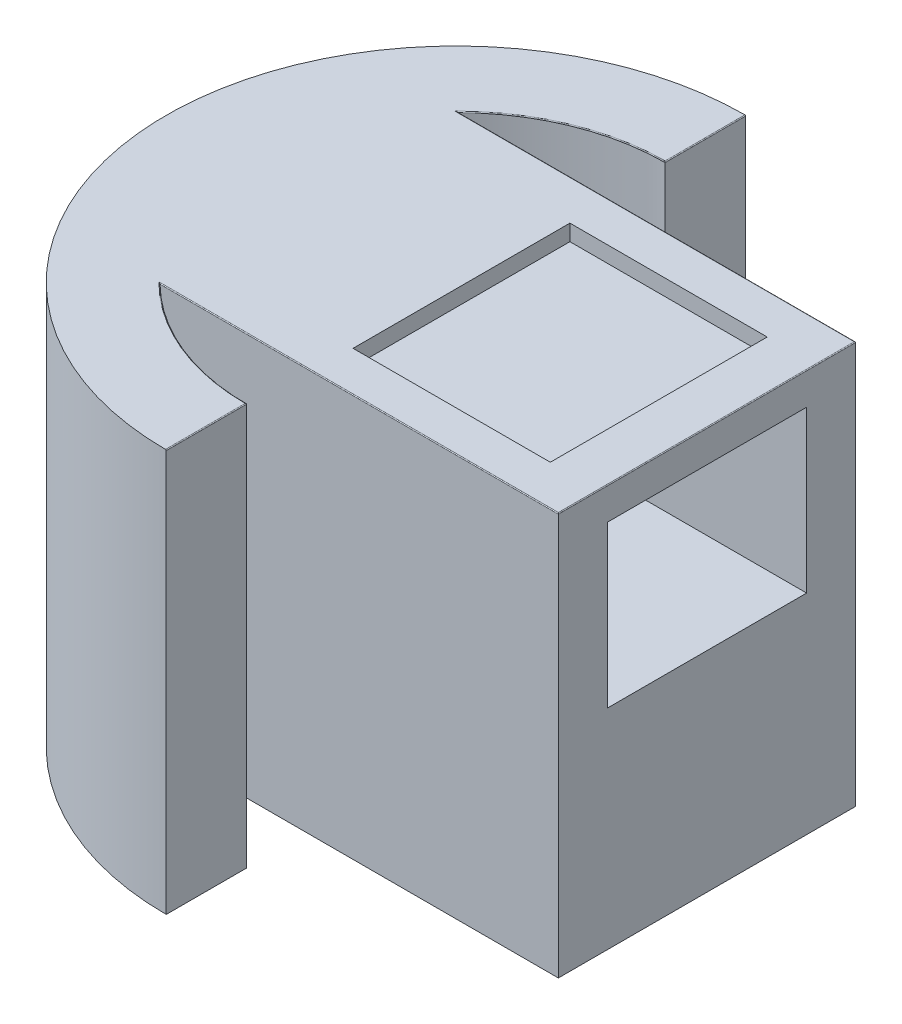
ISO-10303-21;
HEADER;
FILE_DESCRIPTION(('STEP AP214'),'2;1');
FILE_NAME('part.step','',(''),(''),'','','');
FILE_SCHEMA(('AUTOMOTIVE_DESIGN { 1 0 10303 214 1 1 1 1 }'));
ENDSEC;
DATA;
#1=APPLICATION_CONTEXT('core data for automotive mechanical design processes');
#2=APPLICATION_PROTOCOL_DEFINITION('international standard','automotive_design',2000,#1);
#3=PRODUCT_CONTEXT('',#1,'mechanical');
#4=PRODUCT('Part','Part','',(#3));
#5=PRODUCT_RELATED_PRODUCT_CATEGORY('part','',(#4));
#6=PRODUCT_DEFINITION_FORMATION('','',#4);
#7=PRODUCT_DEFINITION_CONTEXT('part definition',#1,'design');
#8=PRODUCT_DEFINITION('design','',#6,#7);
#9=PRODUCT_DEFINITION_SHAPE('','',#8);
#10=(LENGTH_UNIT() NAMED_UNIT(*) SI_UNIT(.MILLI.,.METRE.));
#11=(NAMED_UNIT(*) PLANE_ANGLE_UNIT() SI_UNIT($,.RADIAN.));
#12=(NAMED_UNIT(*) SI_UNIT($,.STERADIAN.) SOLID_ANGLE_UNIT());
#13=UNCERTAINTY_MEASURE_WITH_UNIT(LENGTH_MEASURE(1.E-05),#10,'distance_accuracy_value','');
#14=(GEOMETRIC_REPRESENTATION_CONTEXT(3) GLOBAL_UNCERTAINTY_ASSIGNED_CONTEXT((#13)) GLOBAL_UNIT_ASSIGNED_CONTEXT((#10,
#11,#12)) REPRESENTATION_CONTEXT('',''));
#15=CARTESIAN_POINT('',(0.,0.,0.));
#16=DIRECTION('',(0.,0.,1.));
#17=DIRECTION('',(1.,0.,0.));
#18=AXIS2_PLACEMENT_3D('',#15,#16,#17);
#19=CARTESIAN_POINT('',(0.,1267.46,0.));
#20=DIRECTION('',(0.,1.,0.));
#21=DIRECTION('',(0.,0.,1.));
#22=AXIS2_PLACEMENT_3D('',#19,#20,#21);
#23=TOROIDAL_SURFACE('',#22,662.94,2.54);
#24=CARTESIAN_POINT('',(0.,1267.46,-660.4));
#25=CARTESIAN_POINT('',(1.42268128666522E-05,1267.51697156122,-660.399985739277));
#26=CARTESIAN_POINT('',(-0.00191629645960955,1267.57393215038,-660.401916295759));
#27=CARTESIAN_POINT('',(-0.00955726551875521,1267.68730058438,-660.40955721639));
#28=CARTESIAN_POINT('',(-0.0152647482042104,1267.74370882737,-660.415264617527));
#29=CARTESIAN_POINT('',(-0.0302862196552151,1267.85505703865,-660.430285564916));
#30=CARTESIAN_POINT('',(-0.0395691217146514,1267.9100054144,-660.439568027537));
#31=CARTESIAN_POINT('',(-0.0615459420906366,1268.01851072012,-660.461543166088));
#32=CARTESIAN_POINT('',(-0.0742403486523424,1268.07206744973,-660.474236330149));
#33=CARTESIAN_POINT('',(-0.117021327708974,1268.22979590163,-660.517011577038));
#34=CARTESIAN_POINT('',(-0.151865749227298,1268.33145252699,-660.551849510091));
#35=CARTESIAN_POINT('',(-0.232150203238278,1268.52610626766,-660.632110633245));
#36=CARTESIAN_POINT('',(-0.277614141459752,1268.619083173,-660.677557705573));
#37=CARTESIAN_POINT('',(-0.397351001341178,1268.83148313842,-660.797235209449));
#38=CARTESIAN_POINT('',(-0.475806881344302,1268.94620107169,-660.875640947944));
#39=CARTESIAN_POINT('',(-0.644691584583419,1269.15636831206,-661.04438263438));
#40=CARTESIAN_POINT('',(-0.735143045423288,1269.25178030388,-661.134741138283));
#41=CARTESIAN_POINT('',(-0.960902462877558,1269.45737342501,-661.360217297174));
#42=CARTESIAN_POINT('',(-1.10006942462045,1269.55908976069,-661.499170254411));
#43=CARTESIAN_POINT('',(-1.38803951885014,1269.72994913083,-661.786599556965));
#44=CARTESIAN_POINT('',(-1.53685400999582,1269.79905294619,-661.935087125962));
#45=CARTESIAN_POINT('',(-1.82631473449948,1269.90206606523,-662.223810714509));
#46=CARTESIAN_POINT('',(-1.96650622500646,1269.93856399915,-662.363602016539));
#47=CARTESIAN_POINT('',(-2.24878953581929,1269.98730123466,-662.644988628058));
#48=CARTESIAN_POINT('',(-2.39087677624591,1269.99959103681,-662.786579560563));
#49=CARTESIAN_POINT('',(-2.53523932475807,1269.99999664977,-662.930391599196));
#50=CARTESIAN_POINT('',(-2.53761967996954,1269.99999999563,-662.932762864402));
#51=CARTESIAN_POINT('',(-2.53999999999996,1270.,-662.935134081759));
#52=B_SPLINE_CURVE_WITH_KNOTS('',3,(#24,#25,#26,#27,#28,#29,#30,#31,#32,#33,#34,#35,#36,#37,#38,
#39,#40,#41,#42,#43,#44,#45,#46,#47,#48,#49,#50,#51),.UNSPECIFIED.,.F.,.F.,(4,2,2,2,2,2,2,2,2,2,
2,2,2,4),(0.,0.170831443208251,0.341529024318511,0.510774798488702,0.680044807560644,
1.01729732460059,1.35531647896811,1.83136944970274,2.30833394494594,2.96899857220268,
3.63045568837861,4.23293645679036,4.83415905349827,4.84423877802363),.UNSPECIFIED.);
#53=CARTESIAN_POINT('',(-2.53999999999996,1270.,-662.935134081759));
#54=VERTEX_POINT('',#53);
#55=CARTESIAN_POINT('',(0.,1267.46,-660.4));
#56=VERTEX_POINT('',#55);
#57=EDGE_CURVE('E11',#54,#56,#52,.F.);
#58=ORIENTED_EDGE('',*,*,#57,.F.);
#59=CARTESIAN_POINT('',(0.,1270.,0.));
#60=DIRECTION('',(0.,1.,0.));
#61=DIRECTION('',(0.,0.,1.));
#62=AXIS2_PLACEMENT_3D('',#59,#60,#61);
#63=CIRCLE('',#62,662.94);
#64=CARTESIAN_POINT('',(-470.82425405821,1270.,-466.705437498354));
#65=VERTEX_POINT('',#64);
#66=EDGE_CURVE('E292',#65,#54,#63,.F.);
#67=ORIENTED_EDGE('',*,*,#66,.F.);
#68=CARTESIAN_POINT('',(-464.690089615626,1267.46,-469.245437498354));
#69=CARTESIAN_POINT('',(-464.690079889536,1267.49048681199,-469.245441491255));
#70=CARTESIAN_POINT('',(-464.691424927034,1267.52095542396,-469.244888206205));
#71=CARTESIAN_POINT('',(-464.696729656571,1267.58158678569,-469.242706041538));
#72=CARTESIAN_POINT('',(-464.700685965797,1267.61174987996,-469.241078553516));
#73=CARTESIAN_POINT('',(-464.71619602942,1267.70069783732,-469.234698130451));
#74=CARTESIAN_POINT('',(-464.731396513199,1267.75876600991,-469.228444938733));
#75=CARTESIAN_POINT('',(-464.774942205961,1267.88568270634,-469.210529668624));
#76=CARTESIAN_POINT('',(-464.805632842552,1267.95356621122,-469.197902374507));
#77=CARTESIAN_POINT('',(-464.876715235728,1268.08341076875,-469.168652467879));
#78=CARTESIAN_POINT('',(-464.917159397937,1268.14533721021,-469.152008272212));
#79=CARTESIAN_POINT('',(-464.997589512443,1268.25336122943,-469.118903316281));
#80=CARTESIAN_POINT('',(-465.036540649638,1268.30038126354,-469.102869269673));
#81=CARTESIAN_POINT('',(-465.118067499143,1268.39061673666,-469.0693045079));
#82=CARTESIAN_POINT('',(-465.160645836917,1268.43382937295,-469.051772708597));
#83=CARTESIAN_POINT('',(-465.292560536988,1268.55842543285,-468.997448263501));
#84=CARTESIAN_POINT('',(-465.386017142753,1268.63469233144,-468.958951034095));
#85=CARTESIAN_POINT('',(-465.585984049349,1268.78112203594,-468.876552527276));
#86=CARTESIAN_POINT('',(-465.692949464889,1268.85053213573,-468.832461972394));
#87=CARTESIAN_POINT('',(-465.911845497608,1268.97966804536,-468.742201549513));
#88=CARTESIAN_POINT('',(-466.023781546295,1269.03938291203,-468.696029406039));
#89=CARTESIAN_POINT('',(-466.251252651722,1269.15096000741,-468.602165643945));
#90=CARTESIAN_POINT('',(-466.366796495789,1269.20280090932,-468.554470307682));
#91=CARTESIAN_POINT('',(-466.600198873117,1269.29969552029,-468.45808753791));
#92=CARTESIAN_POINT('',(-466.718056410855,1269.34475207913,-468.409400530768));
#93=CARTESIAN_POINT('',(-466.979657948728,1269.43760261139,-468.301291188021));
#94=CARTESIAN_POINT('',(-467.12379305024,1269.48409054857,-468.241698826429));
#95=CARTESIAN_POINT('',(-467.413890826767,1269.56979261673,-468.121702203863));
#96=CARTESIAN_POINT('',(-467.559853884983,1269.60900519435,-468.061297772448));
#97=CARTESIAN_POINT('',(-467.853254997913,1269.68101046079,-467.939821069677));
#98=CARTESIAN_POINT('',(-468.000694409487,1269.7137965372,-467.878748178014));
#99=CARTESIAN_POINT('',(-468.296569040485,1269.77350056859,-467.756131572841));
#100=CARTESIAN_POINT('',(-468.445004368127,1269.80041787486,-467.694587808058));
#101=CARTESIAN_POINT('',(-468.891039001074,1269.87299878615,-467.509565931779));
#102=CARTESIAN_POINT('',(-469.18974600079,1269.91058148244,-467.385540307845));
#103=CARTESIAN_POINT('',(-469.788573234802,1269.96636807266,-467.136663225516));
#104=CARTESIAN_POINT('',(-470.088693424665,1269.98457257186,-467.011811793037));
#105=CARTESIAN_POINT('',(-470.459665067967,1269.99562480661,-466.857337709595));
#106=CARTESIAN_POINT('',(-470.530383498336,1269.99721797479,-466.827883625786));
#107=CARTESIAN_POINT('',(-470.671807007891,1269.99937663082,-466.768967739323));
#108=CARTESIAN_POINT('',(-470.742512083449,1269.99994246766,-466.739505942691));
#109=CARTESIAN_POINT('',(-470.816893979261,1269.99999860983,-466.708505083329));
#110=CARTESIAN_POINT('',(-470.820574023719,1269.99999999906,-466.706971297758));
#111=CARTESIAN_POINT('',(-470.82425405821,1270.,-466.705437498354));
#112=B_SPLINE_CURVE_WITH_KNOTS('',3,(#68,#69,#70,#71,#72,#73,#74,#75,#76,#77,#78,#79,#80,#81,
#82,#83,#84,#85,#86,#87,#88,#89,#90,#91,#92,#93,#94,#95,#96,#97,#98,#99,#100,#101,#102,#103,
#104,#105,#106,#107,#108,#109,#110,#111),.UNSPECIFIED.,.F.,.F.,(4,2,2,2,2,2,2,2,2,2,2,2,2,2,2,2,
2,2,2,2,2,4),(0.,0.0913925770212093,0.182666989832786,0.362779911058432,0.588223806887862,
0.814907111016094,1.00402398814765,1.19327893550535,1.57208130636585,1.97629521042657,
2.38096223265462,2.78670647493537,3.19227980482719,3.68031464948944,4.16845357458602,
4.65709215394095,5.1457847191171,6.12191251734001,7.0980098265051,7.32787797597145,
7.55766802198873,7.56962866639384),.UNSPECIFIED.);
#113=CARTESIAN_POINT('',(-464.690089615626,1267.46,-469.245437498354));
#114=VERTEX_POINT('',#113);
#115=EDGE_CURVE('E46',#65,#114,#112,.F.);
#116=ORIENTED_EDGE('',*,*,#115,.T.);
#117=CARTESIAN_POINT('',(0.,1267.46,0.));
#118=DIRECTION('',(0.,1.,0.));
#119=DIRECTION('',(0.,0.,1.));
#120=AXIS2_PLACEMENT_3D('',#117,#118,#119);
#121=CIRCLE('',#120,660.4);
#122=EDGE_CURVE('E469',#56,#114,#121,.T.);
#123=ORIENTED_EDGE('',*,*,#122,.F.);
#124=EDGE_LOOP('',(#58,#67,#116,#123));
#125=FACE_BOUND('',#124,.T.);
#126=ADVANCED_FACE('F33',(#125),#23,.T.);
#127=CARTESIAN_POINT('',(0.,1267.46,-466.705437498354));
#128=DIRECTION('',(-1.,0.,0.));
#129=DIRECTION('',(0.,0.,1.));
#130=AXIS2_PLACEMENT_3D('',#127,#128,#129);
#131=CYLINDRICAL_SURFACE('',#130,2.54);
#132=ORIENTED_EDGE('',*,*,#115,.F.);
#133=DIRECTION('',(-1.,0.,0.));
#134=VECTOR('',#133,1.);
#135=CARTESIAN_POINT('',(0.,1270.,-466.705437498354));
#136=LINE('',#135,#134);
#137=CARTESIAN_POINT('',(789.93039193936,1270.,-466.705437498354));
#138=VERTEX_POINT('',#137);
#139=EDGE_CURVE('E295',#138,#65,#136,.T.);
#140=ORIENTED_EDGE('',*,*,#139,.F.);
#141=CARTESIAN_POINT('',(789.93039193936,1267.46,-466.705437498354));
#142=DIRECTION('',(-0.707106781186547,0.,-0.707106781186547));
#143=DIRECTION('',(-0.707106781186547,0.,0.707106781186547));
#144=AXIS2_PLACEMENT_3D('',#141,#142,#143);
#145=ELLIPSE('',#144,3.59210244842766,2.54);
#146=CARTESIAN_POINT('',(792.47039193936,1267.46,-469.245437498354));
#147=VERTEX_POINT('',#146);
#148=EDGE_CURVE('E416',#138,#147,#145,.T.);
#149=ORIENTED_EDGE('',*,*,#148,.T.);
#150=DIRECTION('',(-1.,0.,0.));
#151=VECTOR('',#150,1.);
#152=CARTESIAN_POINT('',(792.47039193936,1267.46,-469.245437498354));
#153=LINE('',#152,#151);
#154=EDGE_CURVE('E464',#114,#147,#153,.F.);
#155=ORIENTED_EDGE('',*,*,#154,.F.);
#156=EDGE_LOOP('',(#132,#140,#149,#155));
#157=FACE_BOUND('',#156,.T.);
#158=ADVANCED_FACE('F399',(#157),#131,.T.);
#159=CARTESIAN_POINT('',(789.93039193936,1267.46,0.));
#160=DIRECTION('',(0.,0.,1.));
#161=DIRECTION('',(1.,0.,0.));
#162=AXIS2_PLACEMENT_3D('',#159,#160,#161);
#163=CYLINDRICAL_SURFACE('',#162,2.54);
#164=ORIENTED_EDGE('',*,*,#148,.F.);
#165=DIRECTION('',(0.,0.,-1.));
#166=VECTOR('',#165,1.);
#167=CARTESIAN_POINT('',(789.93039193936,1270.,0.));
#168=LINE('',#167,#166);
#169=CARTESIAN_POINT('',(789.93039193936,1270.,466.705437498345));
#170=VERTEX_POINT('',#169);
#171=EDGE_CURVE('E298',#170,#138,#168,.T.);
#172=ORIENTED_EDGE('',*,*,#171,.F.);
#173=CARTESIAN_POINT('',(789.93039193936,1267.46,466.705437498345));
#174=DIRECTION('',(-0.707106781186547,0.,0.707106781186547));
#175=DIRECTION('',(0.707106781186547,0.,0.707106781186547));
#176=AXIS2_PLACEMENT_3D('',#173,#174,#175);
#177=ELLIPSE('',#176,3.59210244842766,2.54);
#178=CARTESIAN_POINT('',(792.47039193936,1267.46,469.245437498345));
#179=VERTEX_POINT('',#178);
#180=EDGE_CURVE('E418',#170,#179,#177,.F.);
#181=ORIENTED_EDGE('',*,*,#180,.T.);
#182=DIRECTION('',(0.,0.,-1.));
#183=VECTOR('',#182,1.);
#184=CARTESIAN_POINT('',(792.47039193936,1267.46,0.));
#185=LINE('',#184,#183);
#186=EDGE_CURVE('E461',#147,#179,#185,.F.);
#187=ORIENTED_EDGE('',*,*,#186,.F.);
#188=EDGE_LOOP('',(#164,#172,#181,#187));
#189=FACE_BOUND('',#188,.T.);
#190=ADVANCED_FACE('F35',(#189),#163,.T.);
#191=CARTESIAN_POINT('',(0.,1267.46,466.705437498345));
#192=DIRECTION('',(1.,0.,0.));
#193=DIRECTION('',(0.,0.,-1.));
#194=AXIS2_PLACEMENT_3D('',#191,#192,#193);
#195=CYLINDRICAL_SURFACE('',#194,2.54);
#196=ORIENTED_EDGE('',*,*,#180,.F.);
#197=DIRECTION('',(1.,0.,0.));
#198=VECTOR('',#197,1.);
#199=CARTESIAN_POINT('',(0.,1270.,466.705437498345));
#200=LINE('',#199,#198);
#201=CARTESIAN_POINT('',(-470.824254058219,1270.,466.705437498345));
#202=VERTEX_POINT('',#201);
#203=EDGE_CURVE('E301',#202,#170,#200,.T.);
#204=ORIENTED_EDGE('',*,*,#203,.F.);
#205=CARTESIAN_POINT('',(-464.690089615635,1267.46,469.245437498345));
#206=CARTESIAN_POINT('',(-464.690079889545,1267.49048681199,469.245441491246));
#207=CARTESIAN_POINT('',(-464.691424927043,1267.52095542396,469.244888206196));
#208=CARTESIAN_POINT('',(-464.69672965658,1267.58158678569,469.242706041529));
#209=CARTESIAN_POINT('',(-464.700685965806,1267.61174987996,469.241078553506));
#210=CARTESIAN_POINT('',(-464.716196029429,1267.70069783732,469.234698130442));
#211=CARTESIAN_POINT('',(-464.731396513209,1267.75876600991,469.228444938723));
#212=CARTESIAN_POINT('',(-464.77494220597,1267.88568270634,469.210529668615));
#213=CARTESIAN_POINT('',(-464.805632842562,1267.95356621121,469.197902374498));
#214=CARTESIAN_POINT('',(-464.876715235737,1268.08341076875,469.16865246787));
#215=CARTESIAN_POINT('',(-464.917159397946,1268.14533721021,469.152008272203));
#216=CARTESIAN_POINT('',(-464.997589512453,1268.25336122943,469.118903316272));
#217=CARTESIAN_POINT('',(-465.036540649647,1268.30038126354,469.102869269664));
#218=CARTESIAN_POINT('',(-465.118067499152,1268.39061673666,469.069304507891));
#219=CARTESIAN_POINT('',(-465.160645836926,1268.43382937295,469.051772708588));
#220=CARTESIAN_POINT('',(-465.292560536997,1268.55842543285,468.997448263492));
#221=CARTESIAN_POINT('',(-465.386017142762,1268.63469233144,468.958951034086));
#222=CARTESIAN_POINT('',(-465.585984049358,1268.78112203594,468.876552527267));
#223=CARTESIAN_POINT('',(-465.692949464899,1268.85053213573,468.832461972385));
#224=CARTESIAN_POINT('',(-465.911845497617,1268.97966804536,468.742201549504));
#225=CARTESIAN_POINT('',(-466.023781546304,1269.03938291203,468.696029406029));
#226=CARTESIAN_POINT('',(-466.251252651731,1269.15096000741,468.602165643936));
#227=CARTESIAN_POINT('',(-466.366796495798,1269.20280090932,468.554470307673));
#228=CARTESIAN_POINT('',(-466.600198873126,1269.29969552029,468.458087537901));
#229=CARTESIAN_POINT('',(-466.718056410864,1269.34475207913,468.409400530758));
#230=CARTESIAN_POINT('',(-466.979657948737,1269.43760261139,468.301291188011));
#231=CARTESIAN_POINT('',(-467.123793050249,1269.48409054857,468.24169882642));
#232=CARTESIAN_POINT('',(-467.413890826776,1269.56979261673,468.121702203853));
#233=CARTESIAN_POINT('',(-467.559853884992,1269.60900519435,468.061297772439));
#234=CARTESIAN_POINT('',(-467.853254997922,1269.68101046079,467.939821069668));
#235=CARTESIAN_POINT('',(-468.000694409497,1269.7137965372,467.878748178005));
#236=CARTESIAN_POINT('',(-468.296569040494,1269.77350056859,467.756131572831));
#237=CARTESIAN_POINT('',(-468.445004368136,1269.80041787486,467.694587808049));
#238=CARTESIAN_POINT('',(-468.891039001084,1269.87299878615,467.50956593177));
#239=CARTESIAN_POINT('',(-469.1897460008,1269.91058148244,467.385540307835));
#240=CARTESIAN_POINT('',(-469.788573234812,1269.96636807266,467.136663225506));
#241=CARTESIAN_POINT('',(-470.088693424675,1269.98457257186,467.011811793028));
#242=CARTESIAN_POINT('',(-470.459665067976,1269.99562480661,466.857337709585));
#243=CARTESIAN_POINT('',(-470.530383498345,1269.99721797479,466.827883625777));
#244=CARTESIAN_POINT('',(-470.671807007901,1269.99937663082,466.768967739314));
#245=CARTESIAN_POINT('',(-470.742512083459,1269.99994246766,466.739505942683));
#246=CARTESIAN_POINT('',(-470.81689397927,1269.99999860983,466.70850508332));
#247=CARTESIAN_POINT('',(-470.820574023728,1269.99999999906,466.706971297749));
#248=CARTESIAN_POINT('',(-470.824254058219,1270.,466.705437498345));
#249=B_SPLINE_CURVE_WITH_KNOTS('',3,(#205,#206,#207,#208,#209,#210,#211,#212,#213,#214,#215,
#216,#217,#218,#219,#220,#221,#222,#223,#224,#225,#226,#227,#228,#229,#230,#231,#232,#233,#234,
#235,#236,#237,#238,#239,#240,#241,#242,#243,#244,#245,#246,#247,#248),.UNSPECIFIED.,.F.,.F.,(4,
2,2,2,2,2,2,2,2,2,2,2,2,2,2,2,2,2,2,2,2,4),(0.,0.0913925770212069,0.182666989833013,
0.36277991105844,0.588223806887705,0.814907111016043,1.00402398814743,1.1932789355051,
1.57208130636579,1.97629521042654,2.3809622326546,2.78670647493538,3.19227980482732,
3.6803146494897,4.1684535745863,4.65709215394127,5.14578471911751,6.12191251734055,
7.09800982650575,7.3278779759718,7.55766802198873,7.56962866639381),.UNSPECIFIED.);
#250=CARTESIAN_POINT('',(-464.690089615635,1267.46,469.245437498345));
#251=VERTEX_POINT('',#250);
#252=EDGE_CURVE('E420',#202,#251,#249,.F.);
#253=ORIENTED_EDGE('',*,*,#252,.T.);
#254=DIRECTION('',(1.,0.,0.));
#255=VECTOR('',#254,1.);
#256=CARTESIAN_POINT('',(792.47039193936,1267.46,469.245437498345));
#257=LINE('',#256,#255);
#258=EDGE_CURVE('E458',#179,#251,#257,.F.);
#259=ORIENTED_EDGE('',*,*,#258,.F.);
#260=EDGE_LOOP('',(#196,#204,#253,#259));
#261=FACE_BOUND('',#260,.T.);
#262=ADVANCED_FACE('F407',(#261),#195,.T.);
#263=CARTESIAN_POINT('',(0.,1267.46,0.));
#264=DIRECTION('',(0.,1.,0.));
#265=DIRECTION('',(0.,0.,1.));
#266=AXIS2_PLACEMENT_3D('',#263,#264,#265);
#267=TOROIDAL_SURFACE('',#266,662.94,2.54);
#268=ORIENTED_EDGE('',*,*,#252,.F.);
#269=CARTESIAN_POINT('',(0.,1270.,0.));
#270=DIRECTION('',(0.,1.,0.));
#271=DIRECTION('',(0.,0.,1.));
#272=AXIS2_PLACEMENT_3D('',#269,#270,#271);
#273=CIRCLE('',#272,662.94);
#274=CARTESIAN_POINT('',(-2.54000000000012,1270.,662.935134081759));
#275=VERTEX_POINT('',#274);
#276=EDGE_CURVE('E304',#275,#202,#273,.F.);
#277=ORIENTED_EDGE('',*,*,#276,.F.);
#278=CARTESIAN_POINT('',(-1.20879831054543E-13,1267.46,660.4));
#279=CARTESIAN_POINT('',(1.42268127027399E-05,1267.51697156122,660.399985739277));
#280=CARTESIAN_POINT('',(-0.00191629645977318,1267.57393215038,660.401916295758));
#281=CARTESIAN_POINT('',(-0.00955726551892257,1267.68730058438,660.40955721639));
#282=CARTESIAN_POINT('',(-0.0152647482043872,1267.74370882737,660.415264617527));
#283=CARTESIAN_POINT('',(-0.0302862196554328,1267.85505703866,660.430285564916));
#284=CARTESIAN_POINT('',(-0.0395691217149047,1267.9100054144,660.439568027537));
#285=CARTESIAN_POINT('',(-0.0615459420909022,1268.01851072012,660.461543166088));
#286=CARTESIAN_POINT('',(-0.0742403486525618,1268.07206744973,660.474236330149));
#287=CARTESIAN_POINT('',(-0.117021327709136,1268.22979590163,660.517011577038));
#288=CARTESIAN_POINT('',(-0.151865749227467,1268.33145252699,660.551849510091));
#289=CARTESIAN_POINT('',(-0.232150203238448,1268.52610626766,660.632110633245));
#290=CARTESIAN_POINT('',(-0.277614141459916,1268.619083173,660.677557705573));
#291=CARTESIAN_POINT('',(-0.397351001341335,1268.83148313842,660.797235209449));
#292=CARTESIAN_POINT('',(-0.475806881344463,1268.94620107169,660.875640947944));
#293=CARTESIAN_POINT('',(-0.644691584583581,1269.15636831206,661.04438263438));
#294=CARTESIAN_POINT('',(-0.735143045423449,1269.25178030388,661.134741138283));
#295=CARTESIAN_POINT('',(-0.960902462877719,1269.45737342501,661.360217297174));
#296=CARTESIAN_POINT('',(-1.10006942462061,1269.55908976069,661.499170254411));
#297=CARTESIAN_POINT('',(-1.3880395188503,1269.72994913083,661.786599556965));
#298=CARTESIAN_POINT('',(-1.53685400999598,1269.79905294619,661.935087125962));
#299=CARTESIAN_POINT('',(-1.82631473449964,1269.90206606523,662.223810714509));
#300=CARTESIAN_POINT('',(-1.96650622500662,1269.93856399915,662.363602016539));
#301=CARTESIAN_POINT('',(-2.24878953581945,1269.98730123466,662.644988628058));
#302=CARTESIAN_POINT('',(-2.39087677624607,1269.99959103681,662.786579560563));
#303=CARTESIAN_POINT('',(-2.53523932475823,1269.99999664977,662.930391599196));
#304=CARTESIAN_POINT('',(-2.5376196799697,1269.99999999563,662.932762864402));
#305=CARTESIAN_POINT('',(-2.54000000000012,1270.,662.935134081759));
#306=B_SPLINE_CURVE_WITH_KNOTS('',3,(#278,#279,#280,#281,#282,#283,#284,#285,#286,#287,#288,
#289,#290,#291,#292,#293,#294,#295,#296,#297,#298,#299,#300,#301,#302,#303,#304,#305),
.UNSPECIFIED.,.F.,.F.,(4,2,2,2,2,2,2,2,2,2,2,2,2,4),(0.,0.170831443208248,0.341529024318752,
0.510774798489393,0.680044807560647,1.0172973246006,1.35531647896811,1.83136944970274,
2.30833394494594,2.96899857220268,3.63045568837861,4.23293645679036,4.83415905349828,
4.84423877802363),.UNSPECIFIED.);
#307=CARTESIAN_POINT('',(-1.21313511923537E-13,1267.46,660.4));
#308=VERTEX_POINT('',#307);
#309=EDGE_CURVE('E425',#275,#308,#306,.F.);
#310=ORIENTED_EDGE('',*,*,#309,.T.);
#311=CARTESIAN_POINT('',(0.,1267.46,0.));
#312=DIRECTION('',(0.,1.,0.));
#313=DIRECTION('',(0.,0.,1.));
#314=AXIS2_PLACEMENT_3D('',#311,#312,#313);
#315=CIRCLE('',#314,660.4);
#316=EDGE_CURVE('E453',#251,#308,#315,.T.);
#317=ORIENTED_EDGE('',*,*,#316,.F.);
#318=EDGE_LOOP('',(#268,#277,#310,#317));
#319=FACE_BOUND('',#318,.T.);
#320=ADVANCED_FACE('F430',(#319),#267,.T.);
#321=CARTESIAN_POINT('',(-2.54000000000044,1267.46,0.));
#322=DIRECTION('',(0.,0.,-1.));
#323=DIRECTION('',(-1.,0.,0.));
#324=AXIS2_PLACEMENT_3D('',#321,#322,#323);
#325=CYLINDRICAL_SURFACE('',#324,2.54);
#326=ORIENTED_EDGE('',*,*,#309,.F.);
#327=DIRECTION('',(0.,0.,-1.));
#328=VECTOR('',#327,1.);
#329=CARTESIAN_POINT('',(-2.54000000000044,1270.,0.));
#330=LINE('',#329,#328);
#331=CARTESIAN_POINT('',(-2.54000000000032,1270.,914.396472215417));
#332=VERTEX_POINT('',#331);
#333=EDGE_CURVE('E307',#332,#275,#330,.T.);
#334=ORIENTED_EDGE('',*,*,#333,.F.);
#335=CARTESIAN_POINT('',(0.,1267.46,914.4));
#336=CARTESIAN_POINT('',(6.84539666349094E-06,1267.53144160282,914.399999937354));
#337=CARTESIAN_POINT('',(-0.00301409111381292,1267.60287996101,914.399999998201));
#338=CARTESIAN_POINT('',(-0.0150585536808145,1267.74524554801,914.399999912502));
#339=CARTESIAN_POINT('',(-0.0240817918075308,1267.81617280117,914.399999765964));
#340=CARTESIAN_POINT('',(-0.0480688301825114,1267.95696529452,914.399998811555));
#341=CARTESIAN_POINT('',(-0.0630281381314909,1268.02683129643,914.399998004182));
#342=CARTESIAN_POINT('',(-0.0987659733354335,1268.16503773685,914.399994838848));
#343=CARTESIAN_POINT('',(-0.119544429554363,1268.23337819398,914.399992480907));
#344=CARTESIAN_POINT('',(-0.190440661330753,1268.43545183814,914.399981410369));
#345=CARTESIAN_POINT('',(-0.249129116383607,1268.56629460956,914.399968702381));
#346=CARTESIAN_POINT('',(-0.38760078549087,1268.8161738319,914.399920453192));
#347=CARTESIAN_POINT('',(-0.467380282938567,1268.93521235787,914.399884916013));
#348=CARTESIAN_POINT('',(-0.645796025231843,1269.15822580888,914.399776293083));
#349=CARTESIAN_POINT('',(-0.744432080220602,1269.26220088558,914.39970320771));
#350=CARTESIAN_POINT('',(-0.957781157911137,1269.45213128132,914.399504597806));
#351=CARTESIAN_POINT('',(-1.07249732135919,1269.53808307188,914.399379063022));
#352=CARTESIAN_POINT('',(-1.31474318084672,1269.68952023976,914.3990628334));
#353=CARTESIAN_POINT('',(-1.44227536206088,1269.75500163748,914.398872125907));
#354=CARTESIAN_POINT('',(-1.70649765916122,1269.86358989461,914.398417140613));
#355=CARTESIAN_POINT('',(-1.84318235795951,1269.90670985915,914.398152906043));
#356=CARTESIAN_POINT('',(-2.07391956013375,1269.95863595631,914.397652691805));
#357=CARTESIAN_POINT('',(-2.16652062228896,1269.9741381068,914.397438088084));
#358=CARTESIAN_POINT('',(-2.35273486576908,1269.99481877344,914.396978004006));
#359=CARTESIAN_POINT('',(-2.44634642246552,1270.00001192352,914.396732567942));
#360=CARTESIAN_POINT('',(-2.5400000000003,1270.,914.396472215417));
#361=B_SPLINE_CURVE_WITH_KNOTS('',3,(#335,#336,#337,#338,#339,#340,#341,#342,#343,#344,#345,
#346,#347,#348,#349,#350,#351,#352,#353,#354,#355,#356,#357,#358,#359,#360),.UNSPECIFIED.,.F.,
.F.,(4,2,2,2,2,2,2,2,2,2,2,2,4),(0.,0.21425510848776,0.42849993992046,0.642582943410778,
0.856663333641569,1.28465187289334,1.71256504337039,2.1404739056403,2.56846646328573,
2.99654217439209,3.42436672295228,3.7055021377863,3.98623818633886),.UNSPECIFIED.);
#362=CARTESIAN_POINT('',(0.,1267.46,914.4));
#363=VERTEX_POINT('',#362);
#364=EDGE_CURVE('E320',#363,#332,#361,.T.);
#365=ORIENTED_EDGE('',*,*,#364,.F.);
#366=DIRECTION('',(0.,0.,-1.));
#367=VECTOR('',#366,1.);
#368=CARTESIAN_POINT('',(-1.21313511923537E-13,1267.46,660.4));
#369=LINE('',#368,#367);
#370=EDGE_CURVE('E310',#308,#363,#369,.F.);
#371=ORIENTED_EDGE('',*,*,#370,.F.);
#372=EDGE_LOOP('',(#326,#334,#365,#371));
#373=FACE_BOUND('',#372,.T.);
#374=ADVANCED_FACE('F433',(#373),#325,.T.);
#375=CARTESIAN_POINT('',(-2.54000000000015,1267.46,0.));
#376=DIRECTION('',(0.,0.,-1.));
#377=DIRECTION('',(-1.,0.,0.));
#378=AXIS2_PLACEMENT_3D('',#375,#376,#377);
#379=CYLINDRICAL_SURFACE('',#378,2.54);
#380=DIRECTION('',(0.,0.,-1.));
#381=VECTOR('',#380,1.);
#382=CARTESIAN_POINT('',(-2.54000000000015,1270.,0.));
#383=LINE('',#382,#381);
#384=CARTESIAN_POINT('',(-2.53999999999998,1270.,-914.396472215417));
#385=VERTEX_POINT('',#384);
#386=EDGE_CURVE('E289',#54,#385,#383,.T.);
#387=ORIENTED_EDGE('',*,*,#386,.F.);
#388=ORIENTED_EDGE('',*,*,#57,.T.);
#389=DIRECTION('',(0.,0.,-1.));
#390=VECTOR('',#389,1.);
#391=CARTESIAN_POINT('',(1.11981703314034E-13,1267.46,-914.4));
#392=LINE('',#391,#390);
#393=CARTESIAN_POINT('',(1.11981703314034E-13,1267.46,-914.4));
#394=VERTEX_POINT('',#393);
#395=EDGE_CURVE('E449',#394,#56,#392,.F.);
#396=ORIENTED_EDGE('',*,*,#395,.F.);
#397=CARTESIAN_POINT('',(-2.53999999999998,1270.,-914.396472215417));
#398=CARTESIAN_POINT('',(-2.46855869415582,1270.00000684546,-914.396670745634));
#399=CARTESIAN_POINT('',(-2.39712060828456,1269.99698593392,-914.39686073327));
#400=CARTESIAN_POINT('',(-2.25475551362482,1269.98494155923,-914.397222822489));
#401=CARTESIAN_POINT('',(-2.18382848049873,1269.97591838385,-914.397394924928));
#402=CARTESIAN_POINT('',(-2.0430363725341,1269.9519314965,-914.397720339105));
#403=CARTESIAN_POINT('',(-1.97317053606135,1269.93697227656,-914.397873664938));
#404=CARTESIAN_POINT('',(-1.83496437875715,1269.90123463297,-914.398161465407));
#405=CARTESIAN_POINT('',(-1.76662403930219,1269.8804562804,-914.398295940273));
#406=CARTESIAN_POINT('',(-1.56455066598559,1269.80956036388,-914.398671393298));
#407=CARTESIAN_POINT('',(-1.43370798302388,1269.75087212778,-914.398884530456));
#408=CARTESIAN_POINT('',(-1.18382882039038,1269.61240087706,-914.399242246029));
#409=CARTESIAN_POINT('',(-1.06479026522767,1269.53262157989,-914.399386836513));
#410=CARTESIAN_POINT('',(-0.841776864540823,1269.35420634913,-914.399619342619));
#411=CARTESIAN_POINT('',(-0.73780184176053,1269.25557063745,-914.399707258908));
#412=CARTESIAN_POINT('',(-0.547871424803456,1269.04222222792,-914.399840817443));
#413=CARTESIAN_POINT('',(-0.461919559954087,1268.92750638856,-914.399886451414));
#414=CARTESIAN_POINT('',(-0.31048195643422,1268.68526083262,-914.399950435036));
#415=CARTESIAN_POINT('',(-0.245000243416346,1268.55772860209,-914.399968779322));
#416=CARTESIAN_POINT('',(-0.136411371870073,1268.2935060341,-914.399991447465));
#417=CARTESIAN_POINT('',(-0.0932911074049797,1268.15682111416,-914.399995779543));
#418=CARTESIAN_POINT('',(-0.0413645338693183,1267.92608315958,-914.399999295184));
#419=CARTESIAN_POINT('',(-0.0258622068743546,1267.83348162282,-914.399999734742));
#420=CARTESIAN_POINT('',(-0.00518129493364052,1267.64726632915,-914.400000001966));
#421=CARTESIAN_POINT('',(1.19234487711664E-05,1267.55365419693,-914.399999830501));
#422=CARTESIAN_POINT('',(1.12257276502208E-13,1267.46,-914.4));
#423=B_SPLINE_CURVE_WITH_KNOTS('',3,(#397,#398,#399,#400,#401,#402,#403,#404,#405,#406,#407,
#408,#409,#410,#411,#412,#413,#414,#415,#416,#417,#418,#419,#420,#421,#422),.UNSPECIFIED.,.F.,
.F.,(4,2,2,2,2,2,2,2,2,2,2,2,4),(0.,0.214255047003689,0.428499822304367,0.642582778656176,
0.856663120020509,1.28465161362474,1.71256472112814,2.14047279286722,2.56846458024829,
2.99654048346583,3.42436520910397,3.70550137387278,3.9862381890409),.UNSPECIFIED.);
#424=EDGE_CURVE('E313',#385,#394,#423,.T.);
#425=ORIENTED_EDGE('',*,*,#424,.F.);
#426=EDGE_LOOP('',(#387,#388,#396,#425));
#427=FACE_BOUND('',#426,.T.);
#428=ADVANCED_FACE('F326',(#427),#379,.T.);
#429=CARTESIAN_POINT('',(0.,1270.,0.));
#430=DIRECTION('',(0.,-1.,0.));
#431=DIRECTION('',(0.,0.,-1.));
#432=AXIS2_PLACEMENT_3D('',#429,#430,#431);
#433=CYLINDRICAL_SURFACE('',#432,660.4);
#434=DIRECTION('',(0.,-1.,0.));
#435=VECTOR('',#434,1.);
#436=CARTESIAN_POINT('',(0.,1270.,-660.4));
#437=LINE('',#436,#435);
#438=CARTESIAN_POINT('',(0.,0.,-660.4));
#439=VERTEX_POINT('',#438);
#440=EDGE_CURVE('E283',#56,#439,#437,.T.);
#441=ORIENTED_EDGE('',*,*,#440,.F.);
#442=ORIENTED_EDGE('',*,*,#122,.T.);
#443=DIRECTION('',(0.,-1.,0.));
#444=VECTOR('',#443,1.);
#445=CARTESIAN_POINT('',(-464.690089615626,1270.,-469.245437498354));
#446=LINE('',#445,#444);
#447=CARTESIAN_POINT('',(-464.690089615626,0.,-469.245437498354));
#448=VERTEX_POINT('',#447);
#449=EDGE_CURVE('E220',#448,#114,#446,.F.);
#450=ORIENTED_EDGE('',*,*,#449,.F.);
#451=CARTESIAN_POINT('',(0.,0.,0.));
#452=DIRECTION('',(0.,1.,0.));
#453=DIRECTION('',(1.,0.,0.));
#454=AXIS2_PLACEMENT_3D('',#451,#452,#453);
#455=CIRCLE('',#454,660.4);
#456=EDGE_CURVE('E277',#439,#448,#455,.T.);
#457=ORIENTED_EDGE('',*,*,#456,.F.);
#458=EDGE_LOOP('',(#441,#442,#450,#457));
#459=FACE_BOUND('',#458,.T.);
#460=ADVANCED_FACE('F340',(#459),#433,.F.);
#461=DIRECTION('',(0.,-1.,0.));
#462=VECTOR('',#461,1.);
#463=CARTESIAN_POINT('',(-464.690089615635,1270.,469.245437498345));
#464=LINE('',#463,#462);
#465=CARTESIAN_POINT('',(-464.690089615635,0.,469.245437498345));
#466=VERTEX_POINT('',#465);
#467=EDGE_CURVE('E229',#251,#466,#464,.T.);
#468=ORIENTED_EDGE('',*,*,#467,.F.);
#469=ORIENTED_EDGE('',*,*,#316,.T.);
#470=DIRECTION('',(0.,-1.,0.));
#471=VECTOR('',#470,1.);
#472=CARTESIAN_POINT('',(-1.21313511923537E-13,1270.,660.4));
#473=LINE('',#472,#471);
#474=CARTESIAN_POINT('',(-1.21313511923537E-13,0.,660.4));
#475=VERTEX_POINT('',#474);
#476=EDGE_CURVE('E285',#308,#475,#473,.T.);
#477=ORIENTED_EDGE('',*,*,#476,.T.);
#478=EDGE_CURVE('E276',#466,#475,#455,.T.);
#479=ORIENTED_EDGE('',*,*,#478,.F.);
#480=EDGE_LOOP('',(#468,#469,#477,#479));
#481=FACE_BOUND('',#480,.T.);
#482=ADVANCED_FACE('F333',(#481),#433,.F.);
#483=CARTESIAN_POINT('',(0.,1270.,0.));
#484=DIRECTION('',(0.,-1.,0.));
#485=DIRECTION('',(0.,0.,-1.));
#486=AXIS2_PLACEMENT_3D('',#483,#484,#485);
#487=CYLINDRICAL_SURFACE('',#486,914.4);
#488=CARTESIAN_POINT('',(0.,660.400001701587,0.));
#489=DIRECTION('',(0.,-1.,0.));
#490=DIRECTION('',(0.,0.,-1.));
#491=AXIS2_PLACEMENT_3D('',#488,#489,#490);
#492=CIRCLE('',#491,914.4);
#493=CARTESIAN_POINT('',(-858.71127437319,660.400001701586,314.232886987301));
#494=VERTEX_POINT('',#493);
#495=CARTESIAN_POINT('',(-858.711274373189,660.400001701587,-314.232886987301));
#496=VERTEX_POINT('',#495);
#497=EDGE_CURVE('E257',#494,#496,#492,.T.);
#498=ORIENTED_EDGE('',*,*,#497,.T.);
#499=DIRECTION('',(0.,-1.,0.));
#500=VECTOR('',#499,1.);
#501=CARTESIAN_POINT('',(-858.711274373189,1270.,-314.232886987301));
#502=LINE('',#501,#500);
#503=CARTESIAN_POINT('',(-858.711274373189,1168.40000170159,-314.232886987301));
#504=VERTEX_POINT('',#503);
#505=EDGE_CURVE('E260',#496,#504,#502,.F.);
#506=ORIENTED_EDGE('',*,*,#505,.T.);
#507=CARTESIAN_POINT('',(0.,1168.40000170159,0.));
#508=DIRECTION('',(0.,1.,0.));
#509=DIRECTION('',(0.,0.,1.));
#510=AXIS2_PLACEMENT_3D('',#507,#508,#509);
#511=CIRCLE('',#510,914.4);
#512=CARTESIAN_POINT('',(-858.711274373189,1168.40000170159,314.232886987301));
#513=VERTEX_POINT('',#512);
#514=EDGE_CURVE('E245',#504,#513,#511,.T.);
#515=ORIENTED_EDGE('',*,*,#514,.T.);
#516=DIRECTION('',(0.,-1.,0.));
#517=VECTOR('',#516,1.);
#518=CARTESIAN_POINT('',(-858.711274373189,1270.,314.232886987301));
#519=LINE('',#518,#517);
#520=EDGE_CURVE('E254',#513,#494,#519,.T.);
#521=ORIENTED_EDGE('',*,*,#520,.T.);
#522=EDGE_LOOP('',(#498,#506,#515,#521));
#523=FACE_BOUND('',#522,.T.);
#524=DIRECTION('',(0.,-1.,0.));
#525=VECTOR('',#524,1.);
#526=CARTESIAN_POINT('',(0.,1270.,914.4));
#527=LINE('',#526,#525);
#528=CARTESIAN_POINT('',(0.,0.,914.4));
#529=VERTEX_POINT('',#528);
#530=EDGE_CURVE('E287',#363,#529,#527,.T.);
#531=ORIENTED_EDGE('',*,*,#530,.F.);
#532=ORIENTED_EDGE('',*,*,#364,.T.);
#533=CARTESIAN_POINT('',(0.,1270.,0.));
#534=DIRECTION('',(0.,1.,0.));
#535=DIRECTION('',(0.,0.,1.));
#536=AXIS2_PLACEMENT_3D('',#533,#534,#535);
#537=CIRCLE('',#536,914.4);
#538=EDGE_CURVE('E266',#385,#332,#537,.T.);
#539=ORIENTED_EDGE('',*,*,#538,.F.);
#540=ORIENTED_EDGE('',*,*,#424,.T.);
#541=DIRECTION('',(0.,-1.,0.));
#542=VECTOR('',#541,1.);
#543=CARTESIAN_POINT('',(1.11981703314034E-13,1270.,-914.4));
#544=LINE('',#543,#542);
#545=CARTESIAN_POINT('',(1.11981703314034E-13,0.,-914.4));
#546=VERTEX_POINT('',#545);
#547=EDGE_CURVE('E269',#394,#546,#544,.T.);
#548=ORIENTED_EDGE('',*,*,#547,.T.);
#549=CARTESIAN_POINT('',(0.,0.,0.));
#550=DIRECTION('',(0.,1.,0.));
#551=DIRECTION('',(0.,0.,1.));
#552=AXIS2_PLACEMENT_3D('',#549,#550,#551);
#553=CIRCLE('',#552,914.4);
#554=EDGE_CURVE('E265',#546,#529,#553,.T.);
#555=ORIENTED_EDGE('',*,*,#554,.T.);
#556=EDGE_LOOP('',(#531,#532,#539,#540,#548,#555));
#557=FACE_BOUND('',#556,.T.);
#558=ADVANCED_FACE('F328',(#523,#557),#487,.T.);
#559=CARTESIAN_POINT('',(-1.21313511923537E-13,1270.,660.4));
#560=DIRECTION('',(1.,0.,0.));
#561=DIRECTION('',(0.,0.,-1.));
#562=AXIS2_PLACEMENT_3D('',#559,#560,#561);
#563=PLANE('',#562);
#564=ORIENTED_EDGE('',*,*,#476,.F.);
#565=ORIENTED_EDGE('',*,*,#370,.T.);
#566=ORIENTED_EDGE('',*,*,#530,.T.);
#567=DIRECTION('',(0.,0.,1.));
#568=VECTOR('',#567,1.);
#569=CARTESIAN_POINT('',(-1.21313511923537E-13,0.,660.4));
#570=LINE('',#569,#568);
#571=EDGE_CURVE('E273',#475,#529,#570,.T.);
#572=ORIENTED_EDGE('',*,*,#571,.F.);
#573=EDGE_LOOP('',(#564,#565,#566,#572));
#574=FACE_BOUND('',#573,.T.);
#575=ADVANCED_FACE('F332',(#574),#563,.T.);
#576=CARTESIAN_POINT('',(1.11981703314034E-13,1270.,-914.4));
#577=DIRECTION('',(1.,0.,0.));
#578=DIRECTION('',(0.,0.,-1.));
#579=AXIS2_PLACEMENT_3D('',#576,#577,#578);
#580=PLANE('',#579);
#581=ORIENTED_EDGE('',*,*,#547,.F.);
#582=ORIENTED_EDGE('',*,*,#395,.T.);
#583=ORIENTED_EDGE('',*,*,#440,.T.);
#584=DIRECTION('',(0.,0.,1.));
#585=VECTOR('',#584,1.);
#586=CARTESIAN_POINT('',(1.11981703314034E-13,0.,-914.4));
#587=LINE('',#586,#585);
#588=EDGE_CURVE('E270',#546,#439,#587,.T.);
#589=ORIENTED_EDGE('',*,*,#588,.F.);
#590=EDGE_LOOP('',(#581,#582,#583,#589));
#591=FACE_BOUND('',#590,.T.);
#592=ADVANCED_FACE('F338',(#591),#580,.T.);
#593=CARTESIAN_POINT('',(0.,1270.,0.));
#594=DIRECTION('',(0.,1.,0.));
#595=DIRECTION('',(1.,0.,0.));
#596=AXIS2_PLACEMENT_3D('',#593,#594,#595);
#597=PLANE('',#596);
#598=DIRECTION('',(0.,0.,1.));
#599=VECTOR('',#598,1.);
#600=CARTESIAN_POINT('',(17.4107947228677,1270.,342.245437498345));
#601=LINE('',#600,#599);
#602=CARTESIAN_POINT('',(17.4107947228677,1270.,-342.245437498354));
#603=VERTEX_POINT('',#602);
#604=CARTESIAN_POINT('',(17.4107947228677,1270.,342.245437498345));
#605=VERTEX_POINT('',#604);
#606=EDGE_CURVE('E180',#603,#605,#601,.T.);
#607=ORIENTED_EDGE('',*,*,#606,.F.);
#608=DIRECTION('',(-1.,0.,0.));
#609=VECTOR('',#608,1.);
#610=CARTESIAN_POINT('',(17.4107947228677,1270.,-342.245437498354));
#611=LINE('',#610,#609);
#612=CARTESIAN_POINT('',(640.07039193936,1270.,-342.245437498354));
#613=VERTEX_POINT('',#612);
#614=EDGE_CURVE('E197',#613,#603,#611,.T.);
#615=ORIENTED_EDGE('',*,*,#614,.F.);
#616=DIRECTION('',(0.,0.,-1.));
#617=VECTOR('',#616,1.);
#618=CARTESIAN_POINT('',(640.07039193936,1270.,342.245437498345));
#619=LINE('',#618,#617);
#620=CARTESIAN_POINT('',(640.07039193936,1270.,342.245437498345));
#621=VERTEX_POINT('',#620);
#622=EDGE_CURVE('E200',#621,#613,#619,.T.);
#623=ORIENTED_EDGE('',*,*,#622,.F.);
#624=DIRECTION('',(1.,0.,0.));
#625=VECTOR('',#624,1.);
#626=CARTESIAN_POINT('',(17.4107947228677,1270.,342.245437498345));
#627=LINE('',#626,#625);
#628=EDGE_CURVE('E206',#605,#621,#627,.T.);
#629=ORIENTED_EDGE('',*,*,#628,.F.);
#630=EDGE_LOOP('',(#607,#615,#623,#629));
#631=FACE_BOUND('',#630,.T.);
#632=ORIENTED_EDGE('',*,*,#538,.T.);
#633=ORIENTED_EDGE('',*,*,#333,.T.);
#634=ORIENTED_EDGE('',*,*,#276,.T.);
#635=ORIENTED_EDGE('',*,*,#203,.T.);
#636=ORIENTED_EDGE('',*,*,#171,.T.);
#637=ORIENTED_EDGE('',*,*,#139,.T.);
#638=ORIENTED_EDGE('',*,*,#66,.T.);
#639=ORIENTED_EDGE('',*,*,#386,.T.);
#640=EDGE_LOOP('',(#632,#633,#634,#635,#636,#637,#638,#639));
#641=FACE_BOUND('',#640,.T.);
#642=ADVANCED_FACE('F346',(#631,#641),#597,.T.);
#643=CARTESIAN_POINT('',(0.,0.,0.));
#644=DIRECTION('',(0.,1.,0.));
#645=DIRECTION('',(1.,0.,0.));
#646=AXIS2_PLACEMENT_3D('',#643,#644,#645);
#647=PLANE('',#646);
#648=ORIENTED_EDGE('',*,*,#456,.T.);
#649=DIRECTION('',(-1.,0.,0.));
#650=VECTOR('',#649,1.);
#651=CARTESIAN_POINT('',(792.47039193936,0.,-469.245437498354));
#652=LINE('',#651,#650);
#653=CARTESIAN_POINT('',(792.47039193936,0.,-469.245437498354));
#654=VERTEX_POINT('',#653);
#655=EDGE_CURVE('E212',#654,#448,#652,.T.);
#656=ORIENTED_EDGE('',*,*,#655,.F.);
#657=DIRECTION('',(0.,0.,-1.));
#658=VECTOR('',#657,1.);
#659=CARTESIAN_POINT('',(792.47039193936,0.,-339.632886987301));
#660=LINE('',#659,#658);
#661=CARTESIAN_POINT('',(792.47039193936,0.,469.245437498345));
#662=VERTEX_POINT('',#661);
#663=EDGE_CURVE('E263',#662,#654,#660,.T.);
#664=ORIENTED_EDGE('',*,*,#663,.F.);
#665=DIRECTION('',(1.,0.,0.));
#666=VECTOR('',#665,1.);
#667=CARTESIAN_POINT('',(792.47039193936,0.,469.245437498345));
#668=LINE('',#667,#666);
#669=EDGE_CURVE('E223',#466,#662,#668,.T.);
#670=ORIENTED_EDGE('',*,*,#669,.F.);
#671=ORIENTED_EDGE('',*,*,#478,.T.);
#672=ORIENTED_EDGE('',*,*,#571,.T.);
#673=ORIENTED_EDGE('',*,*,#554,.F.);
#674=ORIENTED_EDGE('',*,*,#588,.T.);
#675=EDGE_LOOP('',(#648,#656,#664,#670,#671,#672,#673,#674));
#676=FACE_BOUND('',#675,.T.);
#677=ADVANCED_FACE('F348',(#676),#647,.F.);
#678=CARTESIAN_POINT('',(792.47039193936,1270.00000170159,-339.632886987301));
#679=DIRECTION('',(-1.,0.,0.));
#680=DIRECTION('',(0.,0.,1.));
#681=AXIS2_PLACEMENT_3D('',#678,#679,#680);
#682=PLANE('',#681);
#683=DIRECTION('',(0.,0.,1.));
#684=VECTOR('',#683,1.);
#685=CARTESIAN_POINT('',(792.47039193936,1168.40000170159,314.232886987301));
#686=LINE('',#685,#684);
#687=CARTESIAN_POINT('',(792.47039193936,1168.40000170159,-314.232886987301));
#688=VERTEX_POINT('',#687);
#689=CARTESIAN_POINT('',(792.47039193936,1168.40000170159,314.232886987301));
#690=VERTEX_POINT('',#689);
#691=EDGE_CURVE('E233',#688,#690,#686,.T.);
#692=ORIENTED_EDGE('',*,*,#691,.F.);
#693=DIRECTION('',(0.,1.,0.));
#694=VECTOR('',#693,1.);
#695=CARTESIAN_POINT('',(792.47039193936,1168.40000170159,-314.232886987301));
#696=LINE('',#695,#694);
#697=CARTESIAN_POINT('',(792.47039193936,660.400001701586,-314.232886987301));
#698=VERTEX_POINT('',#697);
#699=EDGE_CURVE('E231',#698,#688,#696,.T.);
#700=ORIENTED_EDGE('',*,*,#699,.F.);
#701=DIRECTION('',(0.,0.,-1.));
#702=VECTOR('',#701,1.);
#703=CARTESIAN_POINT('',(792.47039193936,660.400001701586,314.232886987301));
#704=LINE('',#703,#702);
#705=CARTESIAN_POINT('',(792.47039193936,660.400001701586,314.232886987301));
#706=VERTEX_POINT('',#705);
#707=EDGE_CURVE('E239',#706,#698,#704,.T.);
#708=ORIENTED_EDGE('',*,*,#707,.F.);
#709=DIRECTION('',(0.,-1.,0.));
#710=VECTOR('',#709,1.);
#711=CARTESIAN_POINT('',(792.47039193936,1168.40000170159,314.232886987301));
#712=LINE('',#711,#710);
#713=EDGE_CURVE('E236',#690,#706,#712,.T.);
#714=ORIENTED_EDGE('',*,*,#713,.F.);
#715=EDGE_LOOP('',(#692,#700,#708,#714));
#716=FACE_BOUND('',#715,.T.);
#717=DIRECTION('',(0.,1.,0.));
#718=VECTOR('',#717,1.);
#719=CARTESIAN_POINT('',(792.47039193936,0.,-469.245437498354));
#720=LINE('',#719,#718);
#721=EDGE_CURVE('E217',#654,#147,#720,.T.);
#722=ORIENTED_EDGE('',*,*,#721,.T.);
#723=ORIENTED_EDGE('',*,*,#186,.T.);
#724=DIRECTION('',(0.,1.,0.));
#725=VECTOR('',#724,1.);
#726=CARTESIAN_POINT('',(792.47039193936,0.,469.245437498345));
#727=LINE('',#726,#725);
#728=EDGE_CURVE('E226',#662,#179,#727,.T.);
#729=ORIENTED_EDGE('',*,*,#728,.F.);
#730=ORIENTED_EDGE('',*,*,#663,.T.);
#731=EDGE_LOOP('',(#722,#723,#729,#730));
#732=FACE_BOUND('',#731,.T.);
#733=ADVANCED_FACE('F351',(#716,#732),#682,.F.);
#734=CARTESIAN_POINT('',(-4287.52960806064,1168.40000170159,-314.232886987301));
#735=DIRECTION('',(0.,0.,-1.));
#736=DIRECTION('',(-1.,0.,0.));
#737=AXIS2_PLACEMENT_3D('',#734,#735,#736);
#738=PLANE('',#737);
#739=DIRECTION('',(1.,0.,0.));
#740=VECTOR('',#739,1.);
#741=CARTESIAN_POINT('',(-4287.52960806064,660.400001701586,-314.232886987301));
#742=LINE('',#741,#740);
#743=EDGE_CURVE('E243',#496,#698,#742,.T.);
#744=ORIENTED_EDGE('',*,*,#743,.T.);
#745=ORIENTED_EDGE('',*,*,#699,.T.);
#746=DIRECTION('',(1.,0.,0.));
#747=VECTOR('',#746,1.);
#748=CARTESIAN_POINT('',(-4287.52960806064,1168.40000170159,-314.232886987301));
#749=LINE('',#748,#747);
#750=EDGE_CURVE('E242',#504,#688,#749,.T.);
#751=ORIENTED_EDGE('',*,*,#750,.F.);
#752=ORIENTED_EDGE('',*,*,#505,.F.);
#753=EDGE_LOOP('',(#744,#745,#751,#752));
#754=FACE_BOUND('',#753,.T.);
#755=ADVANCED_FACE('F358',(#754),#738,.F.);
#756=CARTESIAN_POINT('',(-4287.52960806064,660.400001701586,314.232886987301));
#757=DIRECTION('',(0.,-1.,0.));
#758=DIRECTION('',(0.,0.,-1.));
#759=AXIS2_PLACEMENT_3D('',#756,#757,#758);
#760=PLANE('',#759);
#761=DIRECTION('',(1.,0.,0.));
#762=VECTOR('',#761,1.);
#763=CARTESIAN_POINT('',(-4287.52960806064,660.400001701586,314.232886987301));
#764=LINE('',#763,#762);
#765=EDGE_CURVE('E246',#494,#706,#764,.T.);
#766=ORIENTED_EDGE('',*,*,#765,.T.);
#767=ORIENTED_EDGE('',*,*,#707,.T.);
#768=ORIENTED_EDGE('',*,*,#743,.F.);
#769=ORIENTED_EDGE('',*,*,#497,.F.);
#770=EDGE_LOOP('',(#766,#767,#768,#769));
#771=FACE_BOUND('',#770,.T.);
#772=ADVANCED_FACE('F362',(#771),#760,.F.);
#773=CARTESIAN_POINT('',(-4287.52960806064,1168.40000170159,314.232886987301));
#774=DIRECTION('',(0.,0.,1.));
#775=DIRECTION('',(1.,0.,0.));
#776=AXIS2_PLACEMENT_3D('',#773,#774,#775);
#777=PLANE('',#776);
#778=DIRECTION('',(1.,0.,0.));
#779=VECTOR('',#778,1.);
#780=CARTESIAN_POINT('',(-4287.52960806064,1168.40000170159,314.232886987301));
#781=LINE('',#780,#779);
#782=EDGE_CURVE('E248',#513,#690,#781,.T.);
#783=ORIENTED_EDGE('',*,*,#782,.T.);
#784=ORIENTED_EDGE('',*,*,#713,.T.);
#785=ORIENTED_EDGE('',*,*,#765,.F.);
#786=ORIENTED_EDGE('',*,*,#520,.F.);
#787=EDGE_LOOP('',(#783,#784,#785,#786));
#788=FACE_BOUND('',#787,.T.);
#789=ADVANCED_FACE('F368',(#788),#777,.F.);
#790=CARTESIAN_POINT('',(-4287.52960806064,1168.40000170159,314.232886987301));
#791=DIRECTION('',(0.,1.,0.));
#792=DIRECTION('',(0.,0.,1.));
#793=AXIS2_PLACEMENT_3D('',#790,#791,#792);
#794=PLANE('',#793);
#795=ORIENTED_EDGE('',*,*,#750,.T.);
#796=ORIENTED_EDGE('',*,*,#691,.T.);
#797=ORIENTED_EDGE('',*,*,#782,.F.);
#798=ORIENTED_EDGE('',*,*,#514,.F.);
#799=EDGE_LOOP('',(#795,#796,#797,#798));
#800=FACE_BOUND('',#799,.T.);
#801=ADVANCED_FACE('F364',(#800),#794,.F.);
#802=CARTESIAN_POINT('',(792.47039193936,0.,469.245437498345));
#803=DIRECTION('',(0.,0.,1.));
#804=DIRECTION('',(1.,0.,0.));
#805=AXIS2_PLACEMENT_3D('',#802,#803,#804);
#806=PLANE('',#805);
#807=ORIENTED_EDGE('',*,*,#728,.T.);
#808=ORIENTED_EDGE('',*,*,#258,.T.);
#809=ORIENTED_EDGE('',*,*,#467,.T.);
#810=ORIENTED_EDGE('',*,*,#669,.T.);
#811=EDGE_LOOP('',(#807,#808,#809,#810));
#812=FACE_BOUND('',#811,.T.);
#813=ADVANCED_FACE('F367',(#812),#806,.T.);
#814=CARTESIAN_POINT('',(792.47039193936,0.,-469.245437498354));
#815=DIRECTION('',(0.,0.,-1.));
#816=DIRECTION('',(-1.,0.,0.));
#817=AXIS2_PLACEMENT_3D('',#814,#815,#816);
#818=PLANE('',#817);
#819=ORIENTED_EDGE('',*,*,#449,.T.);
#820=ORIENTED_EDGE('',*,*,#154,.T.);
#821=ORIENTED_EDGE('',*,*,#721,.F.);
#822=ORIENTED_EDGE('',*,*,#655,.T.);
#823=EDGE_LOOP('',(#819,#820,#821,#822));
#824=FACE_BOUND('',#823,.T.);
#825=ADVANCED_FACE('F378',(#824),#818,.T.);
#826=CARTESIAN_POINT('',(17.4107947228677,1219.2,342.245437498345));
#827=DIRECTION('',(-1.,0.,0.));
#828=DIRECTION('',(0.,0.,1.));
#829=AXIS2_PLACEMENT_3D('',#826,#827,#828);
#830=PLANE('',#829);
#831=ORIENTED_EDGE('',*,*,#606,.T.);
#832=DIRECTION('',(0.,1.,0.));
#833=VECTOR('',#832,1.);
#834=CARTESIAN_POINT('',(17.4107947228677,1219.2,342.245437498345));
#835=LINE('',#834,#833);
#836=CARTESIAN_POINT('',(17.4107947228677,1219.2,342.245437498345));
#837=VERTEX_POINT('',#836);
#838=EDGE_CURVE('E173',#837,#605,#835,.T.);
#839=ORIENTED_EDGE('',*,*,#838,.F.);
#840=DIRECTION('',(0.,0.,1.));
#841=VECTOR('',#840,1.);
#842=CARTESIAN_POINT('',(17.4107947228677,1219.2,342.245437498345));
#843=LINE('',#842,#841);
#844=CARTESIAN_POINT('',(17.4107947228677,1219.2,-342.245437498354));
#845=VERTEX_POINT('',#844);
#846=EDGE_CURVE('E177',#845,#837,#843,.T.);
#847=ORIENTED_EDGE('',*,*,#846,.F.);
#848=DIRECTION('',(0.,1.,0.));
#849=VECTOR('',#848,1.);
#850=CARTESIAN_POINT('',(17.4107947228677,1219.2,-342.245437498354));
#851=LINE('',#850,#849);
#852=EDGE_CURVE('E210',#845,#603,#851,.T.);
#853=ORIENTED_EDGE('',*,*,#852,.T.);
#854=EDGE_LOOP('',(#831,#839,#847,#853));
#855=FACE_BOUND('',#854,.T.);
#856=ADVANCED_FACE('F175',(#855),#830,.F.);
#857=CARTESIAN_POINT('',(17.4107947228677,1219.2,-342.245437498354));
#858=DIRECTION('',(0.,0.,-1.));
#859=DIRECTION('',(-1.,0.,0.));
#860=AXIS2_PLACEMENT_3D('',#857,#858,#859);
#861=PLANE('',#860);
#862=ORIENTED_EDGE('',*,*,#614,.T.);
#863=ORIENTED_EDGE('',*,*,#852,.F.);
#864=DIRECTION('',(-1.,0.,0.));
#865=VECTOR('',#864,1.);
#866=CARTESIAN_POINT('',(17.4107947228677,1219.2,-342.245437498354));
#867=LINE('',#866,#865);
#868=CARTESIAN_POINT('',(640.07039193936,1219.2,-342.245437498354));
#869=VERTEX_POINT('',#868);
#870=EDGE_CURVE('E185',#869,#845,#867,.T.);
#871=ORIENTED_EDGE('',*,*,#870,.F.);
#872=DIRECTION('',(0.,1.,0.));
#873=VECTOR('',#872,1.);
#874=CARTESIAN_POINT('',(640.07039193936,1219.2,-342.245437498354));
#875=LINE('',#874,#873);
#876=EDGE_CURVE('E213',#869,#613,#875,.T.);
#877=ORIENTED_EDGE('',*,*,#876,.T.);
#878=EDGE_LOOP('',(#862,#863,#871,#877));
#879=FACE_BOUND('',#878,.T.);
#880=ADVANCED_FACE('F385',(#879),#861,.F.);
#881=CARTESIAN_POINT('',(640.07039193936,1219.2,342.245437498345));
#882=DIRECTION('',(1.,0.,0.));
#883=DIRECTION('',(0.,0.,-1.));
#884=AXIS2_PLACEMENT_3D('',#881,#882,#883);
#885=PLANE('',#884);
#886=ORIENTED_EDGE('',*,*,#622,.T.);
#887=ORIENTED_EDGE('',*,*,#876,.F.);
#888=DIRECTION('',(0.,0.,-1.));
#889=VECTOR('',#888,1.);
#890=CARTESIAN_POINT('',(640.07039193936,1219.2,342.245437498345));
#891=LINE('',#890,#889);
#892=CARTESIAN_POINT('',(640.07039193936,1219.2,342.245437498345));
#893=VERTEX_POINT('',#892);
#894=EDGE_CURVE('E193',#893,#869,#891,.T.);
#895=ORIENTED_EDGE('',*,*,#894,.F.);
#896=DIRECTION('',(0.,1.,0.));
#897=VECTOR('',#896,1.);
#898=CARTESIAN_POINT('',(640.07039193936,1219.2,342.245437498345));
#899=LINE('',#898,#897);
#900=EDGE_CURVE('E184',#893,#621,#899,.T.);
#901=ORIENTED_EDGE('',*,*,#900,.T.);
#902=EDGE_LOOP('',(#886,#887,#895,#901));
#903=FACE_BOUND('',#902,.T.);
#904=ADVANCED_FACE('F388',(#903),#885,.F.);
#905=CARTESIAN_POINT('',(17.4107947228677,1219.2,342.245437498345));
#906=DIRECTION('',(0.,0.,1.));
#907=DIRECTION('',(1.,0.,0.));
#908=AXIS2_PLACEMENT_3D('',#905,#906,#907);
#909=PLANE('',#908);
#910=ORIENTED_EDGE('',*,*,#628,.T.);
#911=ORIENTED_EDGE('',*,*,#900,.F.);
#912=DIRECTION('',(1.,0.,0.));
#913=VECTOR('',#912,1.);
#914=CARTESIAN_POINT('',(17.4107947228677,1219.2,342.245437498345));
#915=LINE('',#914,#913);
#916=EDGE_CURVE('E188',#837,#893,#915,.T.);
#917=ORIENTED_EDGE('',*,*,#916,.F.);
#918=ORIENTED_EDGE('',*,*,#838,.T.);
#919=EDGE_LOOP('',(#910,#911,#917,#918));
#920=FACE_BOUND('',#919,.T.);
#921=ADVANCED_FACE('F189',(#920),#909,.F.);
#922=CARTESIAN_POINT('',(0.,1219.2,0.));
#923=DIRECTION('',(0.,-1.,0.));
#924=DIRECTION('',(0.,0.,-1.));
#925=AXIS2_PLACEMENT_3D('',#922,#923,#924);
#926=PLANE('',#925);
#927=ORIENTED_EDGE('',*,*,#846,.T.);
#928=ORIENTED_EDGE('',*,*,#916,.T.);
#929=ORIENTED_EDGE('',*,*,#894,.T.);
#930=ORIENTED_EDGE('',*,*,#870,.T.);
#931=EDGE_LOOP('',(#927,#928,#929,#930));
#932=FACE_BOUND('',#931,.T.);
#933=ADVANCED_FACE('F195',(#932),#926,.F.);
#934=CLOSED_SHELL('',(#126,#158,#190,#262,#320,#374,#428,#460,#482,#558,#575,#592,#642,#677,
#733,#755,#772,#789,#801,#813,#825,#856,#880,#904,#921,#933));
#935=MANIFOLD_SOLID_BREP('B2',#934);
#936=ADVANCED_BREP_SHAPE_REPRESENTATION('',(#18,#935),#14);
#937=SHAPE_DEFINITION_REPRESENTATION(#9,#936);
ENDSEC;
END-ISO-10303-21;
